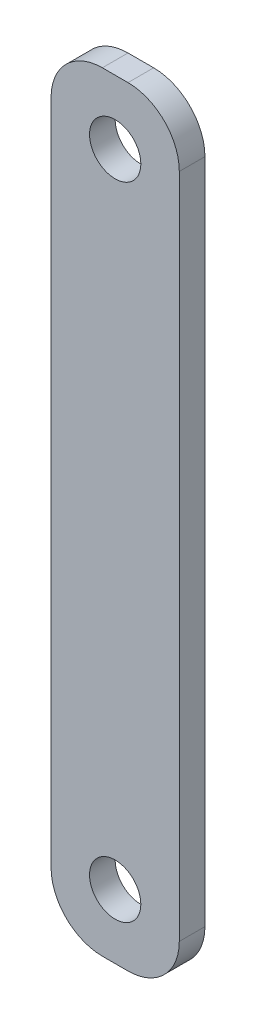
ISO-10303-21;
HEADER;
FILE_DESCRIPTION(('STEP AP214'),'2;1');
FILE_NAME('part.step','',(''),(''),'','','');
FILE_SCHEMA(('AUTOMOTIVE_DESIGN { 1 0 10303 214 1 1 1 1 }'));
ENDSEC;
DATA;
#1=APPLICATION_CONTEXT('core data for automotive mechanical design processes');
#2=APPLICATION_PROTOCOL_DEFINITION('international standard','automotive_design',2000,#1);
#3=PRODUCT_CONTEXT('',#1,'mechanical');
#4=PRODUCT('Part','Part','',(#3));
#5=PRODUCT_RELATED_PRODUCT_CATEGORY('part','',(#4));
#6=PRODUCT_DEFINITION_FORMATION('','',#4);
#7=PRODUCT_DEFINITION_CONTEXT('part definition',#1,'design');
#8=PRODUCT_DEFINITION('design','',#6,#7);
#9=PRODUCT_DEFINITION_SHAPE('','',#8);
#10=(LENGTH_UNIT() NAMED_UNIT(*) SI_UNIT(.MILLI.,.METRE.));
#11=(NAMED_UNIT(*) PLANE_ANGLE_UNIT() SI_UNIT($,.RADIAN.));
#12=(NAMED_UNIT(*) SI_UNIT($,.STERADIAN.) SOLID_ANGLE_UNIT());
#13=UNCERTAINTY_MEASURE_WITH_UNIT(LENGTH_MEASURE(1.E-05),#10,'distance_accuracy_value','');
#14=(GEOMETRIC_REPRESENTATION_CONTEXT(3) GLOBAL_UNCERTAINTY_ASSIGNED_CONTEXT((#13)) GLOBAL_UNIT_ASSIGNED_CONTEXT((#10,
#11,#12)) REPRESENTATION_CONTEXT('',''));
#15=CARTESIAN_POINT('',(0.,0.,0.));
#16=DIRECTION('',(0.,0.,1.));
#17=DIRECTION('',(1.,0.,0.));
#18=AXIS2_PLACEMENT_3D('',#15,#16,#17);
#19=CARTESIAN_POINT('',(0.,0.,1.));
#20=DIRECTION('',(0.,0.,-1.));
#21=DIRECTION('',(-1.,0.,0.));
#22=AXIS2_PLACEMENT_3D('',#19,#20,#21);
#23=PLANE('',#22);
#24=CARTESIAN_POINT('',(2.5,2.5,1.));
#25=DIRECTION('',(0.,0.,1.));
#26=DIRECTION('',(1.,0.,0.));
#27=AXIS2_PLACEMENT_3D('',#24,#25,#26);
#28=CIRCLE('',#27,1.);
#29=CARTESIAN_POINT('',(3.5,2.5,1.));
#30=VERTEX_POINT('',#29);
#31=EDGE_CURVE('E179',#30,#30,#28,.T.);
#32=ORIENTED_EDGE('',*,*,#31,.F.);
#33=EDGE_LOOP('',(#32));
#34=FACE_BOUND('',#33,.T.);
#35=DIRECTION('',(0.,1.,0.));
#36=VECTOR('',#35,1.);
#37=CARTESIAN_POINT('',(5.,0.,1.));
#38=LINE('',#37,#36);
#39=CARTESIAN_POINT('',(5.,2.,1.));
#40=VERTEX_POINT('',#39);
#41=CARTESIAN_POINT('',(4.99999999999999,28.,1.));
#42=VERTEX_POINT('',#41);
#43=EDGE_CURVE('E110',#40,#42,#38,.T.);
#44=ORIENTED_EDGE('',*,*,#43,.T.);
#45=CARTESIAN_POINT('',(2.99999999999999,28.,1.));
#46=DIRECTION('',(0.,0.,-1.));
#47=DIRECTION('',(-1.,0.,0.));
#48=AXIS2_PLACEMENT_3D('',#45,#46,#47);
#49=CIRCLE('',#48,2.);
#50=CARTESIAN_POINT('',(2.99999999999999,30.,1.));
#51=VERTEX_POINT('',#50);
#52=EDGE_CURVE('E11',#42,#51,#49,.F.);
#53=ORIENTED_EDGE('',*,*,#52,.T.);
#54=DIRECTION('',(-1.,0.,0.));
#55=VECTOR('',#54,1.);
#56=CARTESIAN_POINT('',(0.,30.,1.));
#57=LINE('',#56,#55);
#58=CARTESIAN_POINT('',(1.99999999999999,30.,1.));
#59=VERTEX_POINT('',#58);
#60=EDGE_CURVE('E111',#51,#59,#57,.T.);
#61=ORIENTED_EDGE('',*,*,#60,.T.);
#62=CARTESIAN_POINT('',(1.99999999999999,28.,1.));
#63=DIRECTION('',(0.,0.,-1.));
#64=DIRECTION('',(-1.,0.,0.));
#65=AXIS2_PLACEMENT_3D('',#62,#63,#64);
#66=CIRCLE('',#65,2.);
#67=CARTESIAN_POINT('',(0.,28.,1.));
#68=VERTEX_POINT('',#67);
#69=EDGE_CURVE('E147',#59,#68,#66,.F.);
#70=ORIENTED_EDGE('',*,*,#69,.T.);
#71=DIRECTION('',(0.,-1.,0.));
#72=VECTOR('',#71,1.);
#73=CARTESIAN_POINT('',(0.,0.,1.));
#74=LINE('',#73,#72);
#75=CARTESIAN_POINT('',(0.,2.,1.));
#76=VERTEX_POINT('',#75);
#77=EDGE_CURVE('E118',#68,#76,#74,.T.);
#78=ORIENTED_EDGE('',*,*,#77,.T.);
#79=CARTESIAN_POINT('',(2.,2.,1.));
#80=DIRECTION('',(0.,0.,-1.));
#81=DIRECTION('',(-1.,0.,0.));
#82=AXIS2_PLACEMENT_3D('',#79,#80,#81);
#83=CIRCLE('',#82,2.);
#84=CARTESIAN_POINT('',(2.,0.,1.));
#85=VERTEX_POINT('',#84);
#86=EDGE_CURVE('E136',#76,#85,#83,.F.);
#87=ORIENTED_EDGE('',*,*,#86,.T.);
#88=DIRECTION('',(1.,0.,0.));
#89=VECTOR('',#88,1.);
#90=CARTESIAN_POINT('',(0.,0.,1.));
#91=LINE('',#90,#89);
#92=CARTESIAN_POINT('',(3.,0.,1.));
#93=VERTEX_POINT('',#92);
#94=EDGE_CURVE('E171',#85,#93,#91,.T.);
#95=ORIENTED_EDGE('',*,*,#94,.T.);
#96=CARTESIAN_POINT('',(3.,2.,1.));
#97=DIRECTION('',(0.,0.,-1.));
#98=DIRECTION('',(-1.,0.,0.));
#99=AXIS2_PLACEMENT_3D('',#96,#97,#98);
#100=CIRCLE('',#99,2.);
#101=EDGE_CURVE('E125',#93,#40,#100,.F.);
#102=ORIENTED_EDGE('',*,*,#101,.T.);
#103=EDGE_LOOP('',(#44,#53,#61,#70,#78,#87,#95,#102));
#104=FACE_BOUND('',#103,.T.);
#105=CARTESIAN_POINT('',(2.5,27.5,1.));
#106=DIRECTION('',(0.,0.,1.));
#107=DIRECTION('',(1.,0.,0.));
#108=AXIS2_PLACEMENT_3D('',#105,#106,#107);
#109=CIRCLE('',#108,1.);
#110=CARTESIAN_POINT('',(3.5,27.5,1.));
#111=VERTEX_POINT('',#110);
#112=EDGE_CURVE('E184',#111,#111,#109,.T.);
#113=ORIENTED_EDGE('',*,*,#112,.F.);
#114=EDGE_LOOP('',(#113));
#115=FACE_BOUND('',#114,.T.);
#116=ADVANCED_FACE('F33',(#34,#104,#115),#23,.F.);
#117=CARTESIAN_POINT('',(0.,0.,0.));
#118=DIRECTION('',(0.,0.,-1.));
#119=DIRECTION('',(-1.,0.,0.));
#120=AXIS2_PLACEMENT_3D('',#117,#118,#119);
#121=PLANE('',#120);
#122=CARTESIAN_POINT('',(2.5,2.5,0.));
#123=DIRECTION('',(0.,0.,1.));
#124=DIRECTION('',(1.,0.,0.));
#125=AXIS2_PLACEMENT_3D('',#122,#123,#124);
#126=CIRCLE('',#125,1.);
#127=CARTESIAN_POINT('',(3.5,2.5,0.));
#128=VERTEX_POINT('',#127);
#129=EDGE_CURVE('E175',#128,#128,#126,.T.);
#130=ORIENTED_EDGE('',*,*,#129,.T.);
#131=EDGE_LOOP('',(#130));
#132=FACE_BOUND('',#131,.T.);
#133=DIRECTION('',(-1.,0.,0.));
#134=VECTOR('',#133,1.);
#135=CARTESIAN_POINT('',(0.,30.,0.));
#136=LINE('',#135,#134);
#137=CARTESIAN_POINT('',(2.99999999999999,30.,0.));
#138=VERTEX_POINT('',#137);
#139=CARTESIAN_POINT('',(1.99999999999999,30.,0.));
#140=VERTEX_POINT('',#139);
#141=EDGE_CURVE('E115',#138,#140,#136,.T.);
#142=ORIENTED_EDGE('',*,*,#141,.F.);
#143=CARTESIAN_POINT('',(2.99999999999999,28.,0.));
#144=DIRECTION('',(0.,0.,-1.));
#145=DIRECTION('',(-1.,0.,0.));
#146=AXIS2_PLACEMENT_3D('',#143,#144,#145);
#147=CIRCLE('',#146,2.);
#148=CARTESIAN_POINT('',(4.99999999999999,28.,0.));
#149=VERTEX_POINT('',#148);
#150=EDGE_CURVE('E55',#138,#149,#147,.T.);
#151=ORIENTED_EDGE('',*,*,#150,.T.);
#152=DIRECTION('',(0.,1.,0.));
#153=VECTOR('',#152,1.);
#154=CARTESIAN_POINT('',(5.,0.,0.));
#155=LINE('',#154,#153);
#156=CARTESIAN_POINT('',(5.,2.,0.));
#157=VERTEX_POINT('',#156);
#158=EDGE_CURVE('E109',#157,#149,#155,.T.);
#159=ORIENTED_EDGE('',*,*,#158,.F.);
#160=CARTESIAN_POINT('',(3.,2.,0.));
#161=DIRECTION('',(0.,0.,-1.));
#162=DIRECTION('',(-1.,0.,0.));
#163=AXIS2_PLACEMENT_3D('',#160,#161,#162);
#164=CIRCLE('',#163,2.);
#165=CARTESIAN_POINT('',(3.,0.,0.));
#166=VERTEX_POINT('',#165);
#167=EDGE_CURVE('E99',#157,#166,#164,.T.);
#168=ORIENTED_EDGE('',*,*,#167,.T.);
#169=DIRECTION('',(1.,0.,0.));
#170=VECTOR('',#169,1.);
#171=CARTESIAN_POINT('',(0.,0.,0.));
#172=LINE('',#171,#170);
#173=CARTESIAN_POINT('',(2.,0.,0.));
#174=VERTEX_POINT('',#173);
#175=EDGE_CURVE('E116',#174,#166,#172,.T.);
#176=ORIENTED_EDGE('',*,*,#175,.F.);
#177=CARTESIAN_POINT('',(2.,2.,0.));
#178=DIRECTION('',(0.,0.,-1.));
#179=DIRECTION('',(-1.,0.,0.));
#180=AXIS2_PLACEMENT_3D('',#177,#178,#179);
#181=CIRCLE('',#180,2.);
#182=CARTESIAN_POINT('',(0.,2.,0.));
#183=VERTEX_POINT('',#182);
#184=EDGE_CURVE('E130',#174,#183,#181,.T.);
#185=ORIENTED_EDGE('',*,*,#184,.T.);
#186=DIRECTION('',(0.,-1.,0.));
#187=VECTOR('',#186,1.);
#188=CARTESIAN_POINT('',(0.,0.,0.));
#189=LINE('',#188,#187);
#190=CARTESIAN_POINT('',(0.,28.,0.));
#191=VERTEX_POINT('',#190);
#192=EDGE_CURVE('E120',#191,#183,#189,.T.);
#193=ORIENTED_EDGE('',*,*,#192,.F.);
#194=CARTESIAN_POINT('',(1.99999999999999,28.,0.));
#195=DIRECTION('',(0.,0.,-1.));
#196=DIRECTION('',(-1.,0.,0.));
#197=AXIS2_PLACEMENT_3D('',#194,#195,#196);
#198=CIRCLE('',#197,2.);
#199=EDGE_CURVE('E141',#191,#140,#198,.T.);
#200=ORIENTED_EDGE('',*,*,#199,.T.);
#201=EDGE_LOOP('',(#142,#151,#159,#168,#176,#185,#193,#200));
#202=FACE_BOUND('',#201,.T.);
#203=CARTESIAN_POINT('',(2.5,27.5,0.));
#204=DIRECTION('',(0.,0.,1.));
#205=DIRECTION('',(1.,0.,0.));
#206=AXIS2_PLACEMENT_3D('',#203,#204,#205);
#207=CIRCLE('',#206,1.);
#208=CARTESIAN_POINT('',(3.5,27.5,0.));
#209=VERTEX_POINT('',#208);
#210=EDGE_CURVE('E186',#209,#209,#207,.T.);
#211=ORIENTED_EDGE('',*,*,#210,.T.);
#212=EDGE_LOOP('',(#211));
#213=FACE_BOUND('',#212,.T.);
#214=ADVANCED_FACE('F113',(#132,#202,#213),#121,.T.);
#215=CARTESIAN_POINT('',(0.,0.,1.));
#216=DIRECTION('',(1.,0.,0.));
#217=DIRECTION('',(0.,1.,0.));
#218=AXIS2_PLACEMENT_3D('',#215,#216,#217);
#219=PLANE('',#218);
#220=ORIENTED_EDGE('',*,*,#77,.F.);
#221=DIRECTION('',(0.,0.,-1.));
#222=VECTOR('',#221,1.);
#223=CARTESIAN_POINT('',(0.,28.,1.));
#224=LINE('',#223,#222);
#225=EDGE_CURVE('E138',#68,#191,#224,.T.);
#226=ORIENTED_EDGE('',*,*,#225,.T.);
#227=ORIENTED_EDGE('',*,*,#192,.T.);
#228=DIRECTION('',(0.,0.,-1.));
#229=VECTOR('',#228,1.);
#230=CARTESIAN_POINT('',(0.,2.,1.));
#231=LINE('',#230,#229);
#232=EDGE_CURVE('E133',#183,#76,#231,.F.);
#233=ORIENTED_EDGE('',*,*,#232,.T.);
#234=EDGE_LOOP('',(#220,#226,#227,#233));
#235=FACE_BOUND('',#234,.T.);
#236=ADVANCED_FACE('F168',(#235),#219,.F.);
#237=CARTESIAN_POINT('',(0.,0.,1.));
#238=DIRECTION('',(0.,1.,0.));
#239=DIRECTION('',(0.,0.,1.));
#240=AXIS2_PLACEMENT_3D('',#237,#238,#239);
#241=PLANE('',#240);
#242=ORIENTED_EDGE('',*,*,#94,.F.);
#243=DIRECTION('',(0.,0.,-1.));
#244=VECTOR('',#243,1.);
#245=CARTESIAN_POINT('',(2.,0.,1.));
#246=LINE('',#245,#244);
#247=EDGE_CURVE('E127',#85,#174,#246,.T.);
#248=ORIENTED_EDGE('',*,*,#247,.T.);
#249=ORIENTED_EDGE('',*,*,#175,.T.);
#250=DIRECTION('',(0.,0.,-1.));
#251=VECTOR('',#250,1.);
#252=CARTESIAN_POINT('',(3.,0.,1.));
#253=LINE('',#252,#251);
#254=EDGE_CURVE('E105',#166,#93,#253,.F.);
#255=ORIENTED_EDGE('',*,*,#254,.T.);
#256=EDGE_LOOP('',(#242,#248,#249,#255));
#257=FACE_BOUND('',#256,.T.);
#258=ADVANCED_FACE('F210',(#257),#241,.F.);
#259=CARTESIAN_POINT('',(5.,0.,1.));
#260=DIRECTION('',(-1.,0.,0.));
#261=DIRECTION('',(0.,-1.,0.));
#262=AXIS2_PLACEMENT_3D('',#259,#260,#261);
#263=PLANE('',#262);
#264=ORIENTED_EDGE('',*,*,#158,.T.);
#265=DIRECTION('',(0.,0.,-1.));
#266=VECTOR('',#265,1.);
#267=CARTESIAN_POINT('',(4.99999999999999,28.,1.));
#268=LINE('',#267,#266);
#269=EDGE_CURVE('E41',#149,#42,#268,.F.);
#270=ORIENTED_EDGE('',*,*,#269,.T.);
#271=ORIENTED_EDGE('',*,*,#43,.F.);
#272=DIRECTION('',(0.,0.,-1.));
#273=VECTOR('',#272,1.);
#274=CARTESIAN_POINT('',(5.,2.,1.));
#275=LINE('',#274,#273);
#276=EDGE_CURVE('E103',#40,#157,#275,.T.);
#277=ORIENTED_EDGE('',*,*,#276,.T.);
#278=EDGE_LOOP('',(#264,#270,#271,#277));
#279=FACE_BOUND('',#278,.T.);
#280=ADVANCED_FACE('F108',(#279),#263,.F.);
#281=CARTESIAN_POINT('',(0.,30.,1.));
#282=DIRECTION('',(0.,-1.,0.));
#283=DIRECTION('',(0.,0.,-1.));
#284=AXIS2_PLACEMENT_3D('',#281,#282,#283);
#285=PLANE('',#284);
#286=ORIENTED_EDGE('',*,*,#60,.F.);
#287=DIRECTION('',(0.,0.,-1.));
#288=VECTOR('',#287,1.);
#289=CARTESIAN_POINT('',(2.99999999999999,30.,1.));
#290=LINE('',#289,#288);
#291=EDGE_CURVE('E149',#51,#138,#290,.T.);
#292=ORIENTED_EDGE('',*,*,#291,.T.);
#293=ORIENTED_EDGE('',*,*,#141,.T.);
#294=DIRECTION('',(0.,0.,-1.));
#295=VECTOR('',#294,1.);
#296=CARTESIAN_POINT('',(1.99999999999999,30.,1.));
#297=LINE('',#296,#295);
#298=EDGE_CURVE('E144',#140,#59,#297,.F.);
#299=ORIENTED_EDGE('',*,*,#298,.T.);
#300=EDGE_LOOP('',(#286,#292,#293,#299));
#301=FACE_BOUND('',#300,.T.);
#302=ADVANCED_FACE('F155',(#301),#285,.F.);
#303=CARTESIAN_POINT('',(2.5,2.5,1.));
#304=DIRECTION('',(0.,0.,-1.));
#305=DIRECTION('',(-1.,0.,0.));
#306=AXIS2_PLACEMENT_3D('',#303,#304,#305);
#307=CYLINDRICAL_SURFACE('',#306,1.);
#308=ORIENTED_EDGE('',*,*,#31,.T.);
#309=EDGE_LOOP('',(#308));
#310=FACE_BOUND('',#309,.T.);
#311=ORIENTED_EDGE('',*,*,#129,.F.);
#312=EDGE_LOOP('',(#311));
#313=FACE_BOUND('',#312,.T.);
#314=ADVANCED_FACE('F203',(#310,#313),#307,.F.);
#315=CARTESIAN_POINT('',(2.5,27.5,1.));
#316=DIRECTION('',(0.,0.,-1.));
#317=DIRECTION('',(-1.,0.,0.));
#318=AXIS2_PLACEMENT_3D('',#315,#316,#317);
#319=CYLINDRICAL_SURFACE('',#318,1.);
#320=ORIENTED_EDGE('',*,*,#112,.T.);
#321=EDGE_LOOP('',(#320));
#322=FACE_BOUND('',#321,.T.);
#323=ORIENTED_EDGE('',*,*,#210,.F.);
#324=EDGE_LOOP('',(#323));
#325=FACE_BOUND('',#324,.T.);
#326=ADVANCED_FACE('F192',(#322,#325),#319,.F.);
#327=CARTESIAN_POINT('',(3.,2.,1.));
#328=DIRECTION('',(0.,0.,-1.));
#329=DIRECTION('',(-1.,0.,0.));
#330=AXIS2_PLACEMENT_3D('',#327,#328,#329);
#331=CYLINDRICAL_SURFACE('',#330,2.);
#332=ORIENTED_EDGE('',*,*,#101,.F.);
#333=ORIENTED_EDGE('',*,*,#254,.F.);
#334=ORIENTED_EDGE('',*,*,#167,.F.);
#335=ORIENTED_EDGE('',*,*,#276,.F.);
#336=EDGE_LOOP('',(#332,#333,#334,#335));
#337=FACE_BOUND('',#336,.T.);
#338=ADVANCED_FACE('F102',(#337),#331,.T.);
#339=CARTESIAN_POINT('',(2.,2.,1.));
#340=DIRECTION('',(0.,0.,-1.));
#341=DIRECTION('',(-1.,0.,0.));
#342=AXIS2_PLACEMENT_3D('',#339,#340,#341);
#343=CYLINDRICAL_SURFACE('',#342,2.);
#344=ORIENTED_EDGE('',*,*,#86,.F.);
#345=ORIENTED_EDGE('',*,*,#232,.F.);
#346=ORIENTED_EDGE('',*,*,#184,.F.);
#347=ORIENTED_EDGE('',*,*,#247,.F.);
#348=EDGE_LOOP('',(#344,#345,#346,#347));
#349=FACE_BOUND('',#348,.T.);
#350=ADVANCED_FACE('F218',(#349),#343,.T.);
#351=CARTESIAN_POINT('',(1.99999999999999,28.,1.));
#352=DIRECTION('',(0.,0.,-1.));
#353=DIRECTION('',(-1.,0.,0.));
#354=AXIS2_PLACEMENT_3D('',#351,#352,#353);
#355=CYLINDRICAL_SURFACE('',#354,2.);
#356=ORIENTED_EDGE('',*,*,#69,.F.);
#357=ORIENTED_EDGE('',*,*,#298,.F.);
#358=ORIENTED_EDGE('',*,*,#199,.F.);
#359=ORIENTED_EDGE('',*,*,#225,.F.);
#360=EDGE_LOOP('',(#356,#357,#358,#359));
#361=FACE_BOUND('',#360,.T.);
#362=ADVANCED_FACE('F163',(#361),#355,.T.);
#363=CARTESIAN_POINT('',(2.99999999999999,28.,1.));
#364=DIRECTION('',(0.,0.,-1.));
#365=DIRECTION('',(-1.,0.,0.));
#366=AXIS2_PLACEMENT_3D('',#363,#364,#365);
#367=CYLINDRICAL_SURFACE('',#366,2.);
#368=ORIENTED_EDGE('',*,*,#52,.F.);
#369=ORIENTED_EDGE('',*,*,#269,.F.);
#370=ORIENTED_EDGE('',*,*,#150,.F.);
#371=ORIENTED_EDGE('',*,*,#291,.F.);
#372=EDGE_LOOP('',(#368,#369,#370,#371));
#373=FACE_BOUND('',#372,.T.);
#374=ADVANCED_FACE('F35',(#373),#367,.T.);
#375=CLOSED_SHELL('',(#116,#214,#236,#258,#280,#302,#314,#326,#338,#350,#362,#374));
#376=MANIFOLD_SOLID_BREP('B2',#375);
#377=ADVANCED_BREP_SHAPE_REPRESENTATION('',(#18,#376),#14);
#378=SHAPE_DEFINITION_REPRESENTATION(#9,#377);
ENDSEC;
END-ISO-10303-21;
